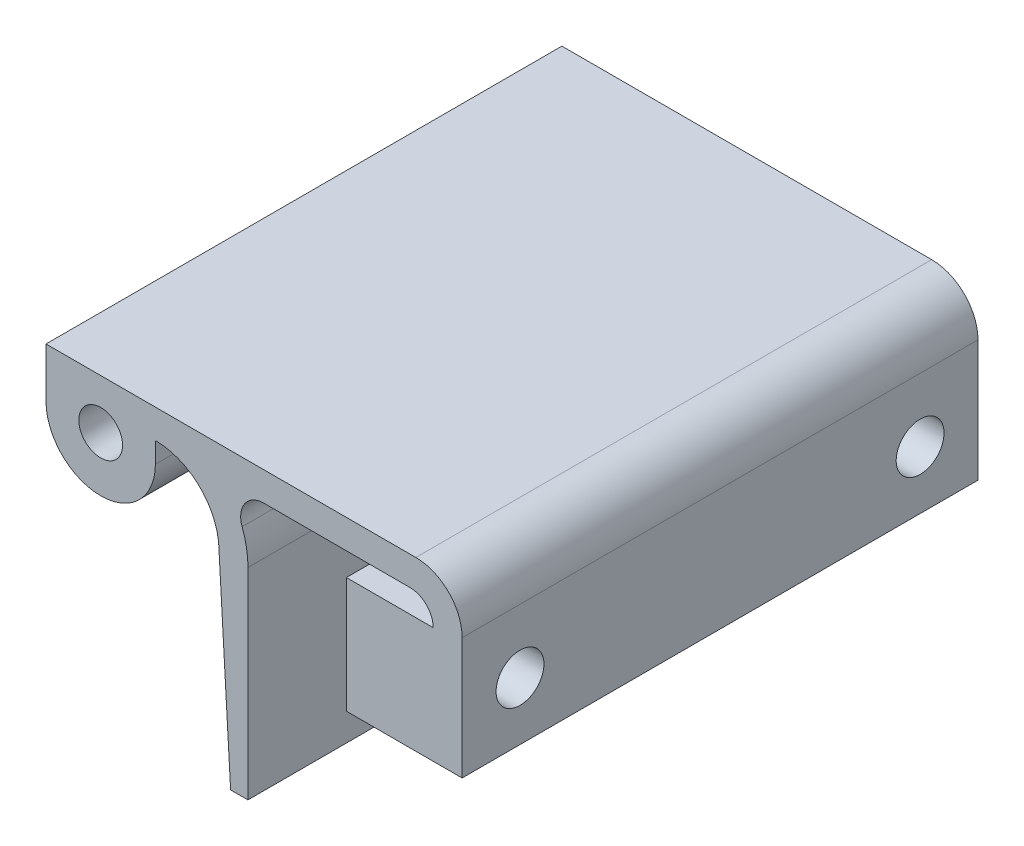
ISO-10303-21;
HEADER;
FILE_DESCRIPTION(('STEP AP214'),'2;1');
FILE_NAME('part.step','',(''),(''),'','','');
FILE_SCHEMA(('AUTOMOTIVE_DESIGN { 1 0 10303 214 1 1 1 1 }'));
ENDSEC;
DATA;
#1=APPLICATION_CONTEXT('core data for automotive mechanical design processes');
#2=APPLICATION_PROTOCOL_DEFINITION('international standard','automotive_design',2000,#1);
#3=PRODUCT_CONTEXT('',#1,'mechanical');
#4=PRODUCT('Part','Part','',(#3));
#5=PRODUCT_RELATED_PRODUCT_CATEGORY('part','',(#4));
#6=PRODUCT_DEFINITION_FORMATION('','',#4);
#7=PRODUCT_DEFINITION_CONTEXT('part definition',#1,'design');
#8=PRODUCT_DEFINITION('design','',#6,#7);
#9=PRODUCT_DEFINITION_SHAPE('','',#8);
#10=(LENGTH_UNIT() NAMED_UNIT(*) SI_UNIT(.MILLI.,.METRE.));
#11=(NAMED_UNIT(*) PLANE_ANGLE_UNIT() SI_UNIT($,.RADIAN.));
#12=(NAMED_UNIT(*) SI_UNIT($,.STERADIAN.) SOLID_ANGLE_UNIT());
#13=UNCERTAINTY_MEASURE_WITH_UNIT(LENGTH_MEASURE(1.E-05),#10,'distance_accuracy_value','');
#14=(GEOMETRIC_REPRESENTATION_CONTEXT(3) GLOBAL_UNCERTAINTY_ASSIGNED_CONTEXT((#13)) GLOBAL_UNIT_ASSIGNED_CONTEXT((#10,
#11,#12)) REPRESENTATION_CONTEXT('',''));
#15=CARTESIAN_POINT('',(0.,0.,0.));
#16=DIRECTION('',(0.,0.,1.));
#17=DIRECTION('',(1.,0.,0.));
#18=AXIS2_PLACEMENT_3D('',#15,#16,#17);
#19=CARTESIAN_POINT('',(-87.6031910632718,204.196458107681,56.59882));
#20=DIRECTION('',(0.,0.,1.));
#21=DIRECTION('',(1.,0.,0.));
#22=AXIS2_PLACEMENT_3D('',#19,#20,#21);
#23=PLANE('',#22);
#24=DIRECTION('',(0.,1.,0.));
#25=VECTOR('',#24,1.);
#26=CARTESIAN_POINT('',(-53.9481910632718,214.356458107681,56.59882));
#27=LINE('',#26,#25);
#28=CARTESIAN_POINT('',(-53.9481910632718,195.941458107681,56.59882));
#29=VERTEX_POINT('',#28);
#30=CARTESIAN_POINT('',(-53.9481910632718,209.276458107681,56.59882));
#31=VERTEX_POINT('',#30);
#32=EDGE_CURVE('E267',#29,#31,#27,.T.);
#33=ORIENTED_EDGE('',*,*,#32,.T.);
#34=CARTESIAN_POINT('',(-59.0281910632718,209.276458107681,56.59882));
#35=DIRECTION('',(0.,0.,1.));
#36=DIRECTION('',(1.,0.,0.));
#37=AXIS2_PLACEMENT_3D('',#34,#35,#36);
#38=CIRCLE('',#37,5.08);
#39=CARTESIAN_POINT('',(-59.0281910632718,214.356458107681,56.59882));
#40=VERTEX_POINT('',#39);
#41=EDGE_CURVE('E11',#31,#40,#38,.T.);
#42=ORIENTED_EDGE('',*,*,#41,.T.);
#43=DIRECTION('',(-1.,0.,0.));
#44=VECTOR('',#43,1.);
#45=CARTESIAN_POINT('',(-76.1731910632717,214.356458107681,56.59882));
#46=LINE('',#45,#44);
#47=CARTESIAN_POINT('',(-99.6031910632718,214.356458107681,56.59882));
#48=VERTEX_POINT('',#47);
#49=EDGE_CURVE('E269',#40,#48,#46,.T.);
#50=ORIENTED_EDGE('',*,*,#49,.T.);
#51=DIRECTION('',(0.,-1.,0.));
#52=VECTOR('',#51,1.);
#53=CARTESIAN_POINT('',(-99.6031910632718,214.356458107681,56.59882));
#54=LINE('',#53,#52);
#55=CARTESIAN_POINT('',(-99.6031910632718,208.926458107681,56.59882));
#56=VERTEX_POINT('',#55);
#57=EDGE_CURVE('E271',#48,#56,#54,.T.);
#58=ORIENTED_EDGE('',*,*,#57,.T.);
#59=CARTESIAN_POINT('',(-93.6031910632718,208.926458107681,56.59882));
#60=DIRECTION('',(0.,0.,1.));
#61=DIRECTION('',(-1.,0.,0.));
#62=AXIS2_PLACEMENT_3D('',#59,#60,#61);
#63=CIRCLE('',#62,6.);
#64=CARTESIAN_POINT('',(-87.6031910632718,208.926458107681,56.59882));
#65=VERTEX_POINT('',#64);
#66=EDGE_CURVE('E273',#56,#65,#63,.T.);
#67=ORIENTED_EDGE('',*,*,#66,.T.);
#68=DIRECTION('',(0.,1.,0.));
#69=VECTOR('',#68,1.);
#70=CARTESIAN_POINT('',(-87.6031910632718,211.181458107681,56.59882));
#71=LINE('',#70,#69);
#72=CARTESIAN_POINT('',(-87.6031910632718,211.181458107681,56.59882));
#73=VERTEX_POINT('',#72);
#74=EDGE_CURVE('E275',#65,#73,#71,.T.);
#75=ORIENTED_EDGE('',*,*,#74,.T.);
#76=CARTESIAN_POINT('',(-87.6031910632718,204.196458107681,56.59882));
#77=DIRECTION('',(0.,0.,-1.));
#78=DIRECTION('',(1.,0.,0.));
#79=AXIS2_PLACEMENT_3D('',#76,#77,#78);
#80=CIRCLE('',#79,6.98499999999999);
#81=CARTESIAN_POINT('',(-80.6181910632718,204.196458107681,56.59882));
#82=VERTEX_POINT('',#81);
#83=EDGE_CURVE('E277',#73,#82,#80,.T.);
#84=ORIENTED_EDGE('',*,*,#83,.T.);
#85=DIRECTION('',(0.0573854701794158,-0.998352096112533,0.));
#86=VECTOR('',#85,1.);
#87=CARTESIAN_POINT('',(-79.3482299485119,182.102566797948,56.59882));
#88=LINE('',#87,#86);
#89=CARTESIAN_POINT('',(-79.3482299485119,182.102566797948,56.59882));
#90=VERTEX_POINT('',#89);
#91=EDGE_CURVE('E279',#82,#90,#88,.T.);
#92=ORIENTED_EDGE('',*,*,#91,.T.);
#93=DIRECTION('',(0.999976021252525,0.00692509349893776,0.));
#94=VECTOR('',#93,1.);
#95=CARTESIAN_POINT('',(-77.4431910632718,182.115759686696,56.59882));
#96=LINE('',#95,#94);
#97=CARTESIAN_POINT('',(-77.4431910632718,182.115759686696,56.59882));
#98=VERTEX_POINT('',#97);
#99=EDGE_CURVE('E281',#90,#98,#96,.T.);
#100=ORIENTED_EDGE('',*,*,#99,.T.);
#101=DIRECTION('',(0.,1.,0.));
#102=VECTOR('',#101,1.);
#103=CARTESIAN_POINT('',(-77.4431910632718,182.115759686696,56.59882));
#104=LINE('',#103,#102);
#105=CARTESIAN_POINT('',(-77.4431910632718,204.196458107681,56.59882));
#106=VERTEX_POINT('',#105);
#107=EDGE_CURVE('E252',#98,#106,#104,.T.);
#108=ORIENTED_EDGE('',*,*,#107,.T.);
#109=CARTESIAN_POINT('',(-87.6031910632718,204.196458107681,56.59882));
#110=DIRECTION('',(0.,0.,1.));
#111=DIRECTION('',(1.,0.,0.));
#112=AXIS2_PLACEMENT_3D('',#109,#110,#111);
#113=CIRCLE('',#112,10.16);
#114=CARTESIAN_POINT('',(-78.0858141137126,207.752458107681,56.59882));
#115=VERTEX_POINT('',#114);
#116=EDGE_CURVE('E255',#106,#115,#113,.T.);
#117=ORIENTED_EDGE('',*,*,#116,.T.);
#118=CARTESIAN_POINT('',(-75.7064698763228,208.641458107681,56.59882));
#119=DIRECTION('',(0.,0.,-1.));
#120=DIRECTION('',(1.,0.,0.));
#121=AXIS2_PLACEMENT_3D('',#118,#119,#120);
#122=CIRCLE('',#121,2.53999999999999);
#123=CARTESIAN_POINT('',(-75.7064698763228,211.181458107681,56.59882));
#124=VERTEX_POINT('',#123);
#125=EDGE_CURVE('E258',#115,#124,#122,.T.);
#126=ORIENTED_EDGE('',*,*,#125,.T.);
#127=DIRECTION('',(1.,0.,0.));
#128=VECTOR('',#127,1.);
#129=CARTESIAN_POINT('',(-59.6631910632718,211.181458107681,56.59882));
#130=LINE('',#129,#128);
#131=CARTESIAN_POINT('',(-59.6631910632718,211.181458107681,56.59882));
#132=VERTEX_POINT('',#131);
#133=EDGE_CURVE('E260',#124,#132,#130,.T.);
#134=ORIENTED_EDGE('',*,*,#133,.T.);
#135=CARTESIAN_POINT('',(-59.6631910632717,208.641458107681,56.59882));
#136=DIRECTION('',(0.,0.,-1.));
#137=DIRECTION('',(1.,0.,0.));
#138=AXIS2_PLACEMENT_3D('',#135,#136,#137);
#139=CIRCLE('',#138,2.53999999999999);
#140=CARTESIAN_POINT('',(-57.1231910632717,208.641458107681,56.59882));
#141=VERTEX_POINT('',#140);
#142=EDGE_CURVE('E262',#132,#141,#139,.T.);
#143=ORIENTED_EDGE('',*,*,#142,.T.);
#144=DIRECTION('',(1.,0.,0.));
#145=VECTOR('',#144,1.);
#146=CARTESIAN_POINT('',(-66.6481910632718,208.641458107681,56.59882));
#147=LINE('',#146,#145);
#148=CARTESIAN_POINT('',(-66.6481910632718,208.641458107681,56.59882));
#149=VERTEX_POINT('',#148);
#150=EDGE_CURVE('E236',#149,#141,#147,.T.);
#151=ORIENTED_EDGE('',*,*,#150,.F.);
#152=DIRECTION('',(0.,-1.,0.));
#153=VECTOR('',#152,1.);
#154=CARTESIAN_POINT('',(-66.6481910632718,195.941458107681,56.59882));
#155=LINE('',#154,#153);
#156=CARTESIAN_POINT('',(-66.6481910632718,195.941458107681,56.59882));
#157=VERTEX_POINT('',#156);
#158=EDGE_CURVE('E223',#149,#157,#155,.T.);
#159=ORIENTED_EDGE('',*,*,#158,.T.);
#160=DIRECTION('',(1.,0.,0.));
#161=VECTOR('',#160,1.);
#162=CARTESIAN_POINT('',(-57.1231910632717,195.941458107681,56.59882));
#163=LINE('',#162,#161);
#164=EDGE_CURVE('E265',#157,#29,#163,.T.);
#165=ORIENTED_EDGE('',*,*,#164,.T.);
#166=EDGE_LOOP('',(#33,#42,#50,#58,#67,#75,#84,#92,#100,#108,#117,#126,#134,#143,#151,#159,#165));
#167=FACE_BOUND('',#166,.T.);
#168=CARTESIAN_POINT('',(-93.6031910632718,208.926458107681,56.59882));
#169=DIRECTION('',(0.,0.,1.));
#170=DIRECTION('',(1.,0.,0.));
#171=AXIS2_PLACEMENT_3D('',#168,#169,#170);
#172=CIRCLE('',#171,2.40000000000135);
#173=CARTESIAN_POINT('',(-91.2031910632704,208.926458107681,56.59882));
#174=VERTEX_POINT('',#173);
#175=EDGE_CURVE('E246',#174,#174,#172,.T.);
#176=ORIENTED_EDGE('',*,*,#175,.F.);
#177=EDGE_LOOP('',(#176));
#178=FACE_BOUND('',#177,.T.);
#179=ADVANCED_FACE('F36',(#167,#178),#23,.T.);
#180=CARTESIAN_POINT('',(-87.6031910632718,204.196458107681,0.));
#181=DIRECTION('',(0.,0.,1.));
#182=DIRECTION('',(1.,0.,0.));
#183=AXIS2_PLACEMENT_3D('',#180,#181,#182);
#184=PLANE('',#183);
#185=DIRECTION('',(-1.,0.,0.));
#186=VECTOR('',#185,1.);
#187=CARTESIAN_POINT('',(-99.6031910632718,214.356458107681,0.));
#188=LINE('',#187,#186);
#189=CARTESIAN_POINT('',(-59.0281910632718,214.356458107681,0.));
#190=VERTEX_POINT('',#189);
#191=CARTESIAN_POINT('',(-99.6031910632718,214.356458107681,0.));
#192=VERTEX_POINT('',#191);
#193=EDGE_CURVE('E297',#190,#192,#188,.T.);
#194=ORIENTED_EDGE('',*,*,#193,.F.);
#195=CARTESIAN_POINT('',(-59.0281910632718,209.276458107681,0.));
#196=DIRECTION('',(0.,0.,1.));
#197=DIRECTION('',(1.,0.,0.));
#198=AXIS2_PLACEMENT_3D('',#195,#196,#197);
#199=CIRCLE('',#198,5.08);
#200=CARTESIAN_POINT('',(-53.9481910632718,209.276458107681,0.));
#201=VERTEX_POINT('',#200);
#202=EDGE_CURVE('E58',#190,#201,#199,.F.);
#203=ORIENTED_EDGE('',*,*,#202,.T.);
#204=DIRECTION('',(0.,1.,0.));
#205=VECTOR('',#204,1.);
#206=CARTESIAN_POINT('',(-53.9481910632718,214.356458107681,0.));
#207=LINE('',#206,#205);
#208=CARTESIAN_POINT('',(-53.9481910632718,195.941458107681,0.));
#209=VERTEX_POINT('',#208);
#210=EDGE_CURVE('E295',#209,#201,#207,.T.);
#211=ORIENTED_EDGE('',*,*,#210,.F.);
#212=DIRECTION('',(1.,0.,0.));
#213=VECTOR('',#212,1.);
#214=CARTESIAN_POINT('',(-57.1231910632717,195.941458107681,0.));
#215=LINE('',#214,#213);
#216=CARTESIAN_POINT('',(-66.6481910632718,195.941458107681,0.));
#217=VERTEX_POINT('',#216);
#218=EDGE_CURVE('E204',#217,#209,#215,.T.);
#219=ORIENTED_EDGE('',*,*,#218,.F.);
#220=DIRECTION('',(0.,1.,0.));
#221=VECTOR('',#220,1.);
#222=CARTESIAN_POINT('',(-66.6481910632718,195.941458107681,0.));
#223=LINE('',#222,#221);
#224=CARTESIAN_POINT('',(-66.6481910632718,208.641458107681,0.));
#225=VERTEX_POINT('',#224);
#226=EDGE_CURVE('E196',#217,#225,#223,.T.);
#227=ORIENTED_EDGE('',*,*,#226,.T.);
#228=DIRECTION('',(1.,0.,0.));
#229=VECTOR('',#228,1.);
#230=CARTESIAN_POINT('',(-66.6481910632718,208.641458107681,0.));
#231=LINE('',#230,#229);
#232=CARTESIAN_POINT('',(-57.1231910632717,208.641458107681,0.));
#233=VERTEX_POINT('',#232);
#234=EDGE_CURVE('E180',#225,#233,#231,.T.);
#235=ORIENTED_EDGE('',*,*,#234,.T.);
#236=CARTESIAN_POINT('',(-59.6631910632717,208.641458107681,0.));
#237=DIRECTION('',(0.,0.,-1.));
#238=DIRECTION('',(1.,0.,0.));
#239=AXIS2_PLACEMENT_3D('',#236,#237,#238);
#240=CIRCLE('',#239,2.53999999999999);
#241=CARTESIAN_POINT('',(-59.6631910632718,211.181458107681,0.));
#242=VERTEX_POINT('',#241);
#243=EDGE_CURVE('E292',#242,#233,#240,.T.);
#244=ORIENTED_EDGE('',*,*,#243,.F.);
#245=DIRECTION('',(1.,0.,0.));
#246=VECTOR('',#245,1.);
#247=CARTESIAN_POINT('',(-59.6631910632718,211.181458107681,0.));
#248=LINE('',#247,#246);
#249=CARTESIAN_POINT('',(-75.7064698763228,211.181458107681,0.));
#250=VERTEX_POINT('',#249);
#251=EDGE_CURVE('E290',#250,#242,#248,.T.);
#252=ORIENTED_EDGE('',*,*,#251,.F.);
#253=CARTESIAN_POINT('',(-75.7064698763228,208.641458107681,0.));
#254=DIRECTION('',(0.,0.,-1.));
#255=DIRECTION('',(1.,0.,0.));
#256=AXIS2_PLACEMENT_3D('',#253,#254,#255);
#257=CIRCLE('',#256,2.53999999999999);
#258=CARTESIAN_POINT('',(-78.0858141137126,207.752458107681,0.));
#259=VERTEX_POINT('',#258);
#260=EDGE_CURVE('E288',#259,#250,#257,.T.);
#261=ORIENTED_EDGE('',*,*,#260,.F.);
#262=CARTESIAN_POINT('',(-87.6031910632718,204.196458107681,0.));
#263=DIRECTION('',(0.,0.,1.));
#264=DIRECTION('',(1.,0.,0.));
#265=AXIS2_PLACEMENT_3D('',#262,#263,#264);
#266=CIRCLE('',#265,10.16);
#267=CARTESIAN_POINT('',(-77.4431910632718,204.196458107681,0.));
#268=VERTEX_POINT('',#267);
#269=EDGE_CURVE('E286',#268,#259,#266,.T.);
#270=ORIENTED_EDGE('',*,*,#269,.F.);
#271=DIRECTION('',(0.,1.,0.));
#272=VECTOR('',#271,1.);
#273=CARTESIAN_POINT('',(-77.4431910632718,182.115759686696,0.));
#274=LINE('',#273,#272);
#275=CARTESIAN_POINT('',(-77.4431910632718,182.115759686696,0.));
#276=VERTEX_POINT('',#275);
#277=EDGE_CURVE('E249',#276,#268,#274,.T.);
#278=ORIENTED_EDGE('',*,*,#277,.F.);
#279=DIRECTION('',(0.999976021252525,0.00692509349893776,0.));
#280=VECTOR('',#279,1.);
#281=CARTESIAN_POINT('',(-77.4431910632718,182.115759686696,0.));
#282=LINE('',#281,#280);
#283=CARTESIAN_POINT('',(-79.3482299485119,182.102566797948,0.));
#284=VERTEX_POINT('',#283);
#285=EDGE_CURVE('E256',#284,#276,#282,.T.);
#286=ORIENTED_EDGE('',*,*,#285,.F.);
#287=DIRECTION('',(0.0573854701794158,-0.998352096112533,0.));
#288=VECTOR('',#287,1.);
#289=CARTESIAN_POINT('',(-79.3482299485119,182.102566797948,0.));
#290=LINE('',#289,#288);
#291=CARTESIAN_POINT('',(-80.6181910632718,204.196458107681,0.));
#292=VERTEX_POINT('',#291);
#293=EDGE_CURVE('E307',#292,#284,#290,.T.);
#294=ORIENTED_EDGE('',*,*,#293,.F.);
#295=CARTESIAN_POINT('',(-87.6031910632718,204.196458107681,0.));
#296=DIRECTION('',(0.,0.,-1.));
#297=DIRECTION('',(1.,0.,0.));
#298=AXIS2_PLACEMENT_3D('',#295,#296,#297);
#299=CIRCLE('',#298,6.98499999999999);
#300=CARTESIAN_POINT('',(-87.6031910632718,211.181458107681,0.));
#301=VERTEX_POINT('',#300);
#302=EDGE_CURVE('E305',#301,#292,#299,.T.);
#303=ORIENTED_EDGE('',*,*,#302,.F.);
#304=DIRECTION('',(0.,1.,0.));
#305=VECTOR('',#304,1.);
#306=CARTESIAN_POINT('',(-87.6031910632718,211.181458107681,0.));
#307=LINE('',#306,#305);
#308=CARTESIAN_POINT('',(-87.6031910632718,208.926458107681,0.));
#309=VERTEX_POINT('',#308);
#310=EDGE_CURVE('E303',#309,#301,#307,.T.);
#311=ORIENTED_EDGE('',*,*,#310,.F.);
#312=CARTESIAN_POINT('',(-93.6031910632718,208.926458107681,0.));
#313=DIRECTION('',(0.,0.,1.));
#314=DIRECTION('',(-1.,0.,0.));
#315=AXIS2_PLACEMENT_3D('',#312,#313,#314);
#316=CIRCLE('',#315,6.);
#317=CARTESIAN_POINT('',(-99.6031910632718,208.926458107681,0.));
#318=VERTEX_POINT('',#317);
#319=EDGE_CURVE('E301',#318,#309,#316,.T.);
#320=ORIENTED_EDGE('',*,*,#319,.F.);
#321=DIRECTION('',(0.,-1.,0.));
#322=VECTOR('',#321,1.);
#323=CARTESIAN_POINT('',(-99.6031910632718,214.356458107681,0.));
#324=LINE('',#323,#322);
#325=EDGE_CURVE('E299',#192,#318,#324,.T.);
#326=ORIENTED_EDGE('',*,*,#325,.F.);
#327=EDGE_LOOP('',(#194,#203,#211,#219,#227,#235,#244,#252,#261,#270,#278,#286,#294,#303,#311,
#320,#326));
#328=FACE_BOUND('',#327,.T.);
#329=CARTESIAN_POINT('',(-93.6031910632718,208.926458107681,0.));
#330=DIRECTION('',(0.,0.,1.));
#331=DIRECTION('',(1.,0.,0.));
#332=AXIS2_PLACEMENT_3D('',#329,#330,#331);
#333=CIRCLE('',#332,2.40000000000135);
#334=CARTESIAN_POINT('',(-91.2031910632704,208.926458107681,0.));
#335=VERTEX_POINT('',#334);
#336=EDGE_CURVE('E245',#335,#335,#333,.T.);
#337=ORIENTED_EDGE('',*,*,#336,.T.);
#338=EDGE_LOOP('',(#337));
#339=FACE_BOUND('',#338,.T.);
#340=ADVANCED_FACE('F201',(#328,#339),#184,.F.);
#341=CARTESIAN_POINT('',(-77.4431910632718,182.115759686696,56.59882));
#342=DIRECTION('',(-1.,0.,0.));
#343=DIRECTION('',(0.,0.,1.));
#344=AXIS2_PLACEMENT_3D('',#341,#342,#343);
#345=PLANE('',#344);
#346=ORIENTED_EDGE('',*,*,#277,.T.);
#347=DIRECTION('',(0.,0.,-1.));
#348=VECTOR('',#347,1.);
#349=CARTESIAN_POINT('',(-77.4431910632718,204.196458107681,56.59882));
#350=LINE('',#349,#348);
#351=EDGE_CURVE('E347',#106,#268,#350,.T.);
#352=ORIENTED_EDGE('',*,*,#351,.F.);
#353=ORIENTED_EDGE('',*,*,#107,.F.);
#354=DIRECTION('',(0.,0.,-1.));
#355=VECTOR('',#354,1.);
#356=CARTESIAN_POINT('',(-77.4431910632718,182.115759686696,56.59882));
#357=LINE('',#356,#355);
#358=EDGE_CURVE('E283',#98,#276,#357,.T.);
#359=ORIENTED_EDGE('',*,*,#358,.T.);
#360=EDGE_LOOP('',(#346,#352,#353,#359));
#361=FACE_BOUND('',#360,.T.);
#362=ADVANCED_FACE('F388',(#361),#345,.F.);
#363=CARTESIAN_POINT('',(-87.6031910632718,204.196458107681,56.59882));
#364=DIRECTION('',(0.,0.,-1.));
#365=DIRECTION('',(-1.,0.,0.));
#366=AXIS2_PLACEMENT_3D('',#363,#364,#365);
#367=CYLINDRICAL_SURFACE('',#366,10.16);
#368=ORIENTED_EDGE('',*,*,#269,.T.);
#369=DIRECTION('',(0.,0.,-1.));
#370=VECTOR('',#369,1.);
#371=CARTESIAN_POINT('',(-78.0858141137126,207.752458107681,56.59882));
#372=LINE('',#371,#370);
#373=EDGE_CURVE('E344',#115,#259,#372,.T.);
#374=ORIENTED_EDGE('',*,*,#373,.F.);
#375=ORIENTED_EDGE('',*,*,#116,.F.);
#376=ORIENTED_EDGE('',*,*,#351,.T.);
#377=EDGE_LOOP('',(#368,#374,#375,#376));
#378=FACE_BOUND('',#377,.T.);
#379=ADVANCED_FACE('F439',(#378),#367,.T.);
#380=CARTESIAN_POINT('',(-75.7064698763228,208.641458107681,56.59882));
#381=DIRECTION('',(0.,0.,-1.));
#382=DIRECTION('',(-1.,0.,0.));
#383=AXIS2_PLACEMENT_3D('',#380,#381,#382);
#384=CYLINDRICAL_SURFACE('',#383,2.53999999999999);
#385=ORIENTED_EDGE('',*,*,#260,.T.);
#386=DIRECTION('',(0.,0.,-1.));
#387=VECTOR('',#386,1.);
#388=CARTESIAN_POINT('',(-75.7064698763228,211.181458107681,56.59882));
#389=LINE('',#388,#387);
#390=EDGE_CURVE('E341',#124,#250,#389,.T.);
#391=ORIENTED_EDGE('',*,*,#390,.F.);
#392=ORIENTED_EDGE('',*,*,#125,.F.);
#393=ORIENTED_EDGE('',*,*,#373,.T.);
#394=EDGE_LOOP('',(#385,#391,#392,#393));
#395=FACE_BOUND('',#394,.T.);
#396=ADVANCED_FACE('F435',(#395),#384,.F.);
#397=CARTESIAN_POINT('',(-59.6631910632718,211.181458107681,56.59882));
#398=DIRECTION('',(0.,1.,0.));
#399=DIRECTION('',(0.,0.,1.));
#400=AXIS2_PLACEMENT_3D('',#397,#398,#399);
#401=PLANE('',#400);
#402=ORIENTED_EDGE('',*,*,#251,.T.);
#403=DIRECTION('',(0.,0.,-1.));
#404=VECTOR('',#403,1.);
#405=CARTESIAN_POINT('',(-59.6631910632718,211.181458107681,56.59882));
#406=LINE('',#405,#404);
#407=EDGE_CURVE('E338',#132,#242,#406,.T.);
#408=ORIENTED_EDGE('',*,*,#407,.F.);
#409=ORIENTED_EDGE('',*,*,#133,.F.);
#410=ORIENTED_EDGE('',*,*,#390,.T.);
#411=EDGE_LOOP('',(#402,#408,#409,#410));
#412=FACE_BOUND('',#411,.T.);
#413=ADVANCED_FACE('F431',(#412),#401,.F.);
#414=CARTESIAN_POINT('',(-59.6631910632717,208.641458107681,56.59882));
#415=DIRECTION('',(0.,0.,-1.));
#416=DIRECTION('',(-1.,0.,0.));
#417=AXIS2_PLACEMENT_3D('',#414,#415,#416);
#418=CYLINDRICAL_SURFACE('',#417,2.53999999999999);
#419=ORIENTED_EDGE('',*,*,#243,.T.);
#420=DIRECTION('',(0.,0.,1.));
#421=VECTOR('',#420,1.);
#422=CARTESIAN_POINT('',(-57.1231910632717,208.641458107681,56.59882));
#423=LINE('',#422,#421);
#424=CARTESIAN_POINT('',(-57.1231910632717,208.641458107681,12.7));
#425=VERTEX_POINT('',#424);
#426=EDGE_CURVE('E185',#233,#425,#423,.T.);
#427=ORIENTED_EDGE('',*,*,#426,.T.);
#428=DIRECTION('',(0.,0.,-1.));
#429=VECTOR('',#428,1.);
#430=CARTESIAN_POINT('',(-57.1231910632717,208.641458107681,56.59882));
#431=LINE('',#430,#429);
#432=CARTESIAN_POINT('',(-57.1231910632717,208.641458107681,43.89882));
#433=VERTEX_POINT('',#432);
#434=EDGE_CURVE('E335',#433,#425,#431,.T.);
#435=ORIENTED_EDGE('',*,*,#434,.F.);
#436=EDGE_CURVE('E336',#141,#433,#431,.T.);
#437=ORIENTED_EDGE('',*,*,#436,.F.);
#438=ORIENTED_EDGE('',*,*,#142,.F.);
#439=ORIENTED_EDGE('',*,*,#407,.T.);
#440=EDGE_LOOP('',(#419,#427,#435,#437,#438,#439));
#441=FACE_BOUND('',#440,.T.);
#442=ADVANCED_FACE('F427',(#441),#418,.F.);
#443=CARTESIAN_POINT('',(-57.1231910632717,208.641458107681,56.59882));
#444=DIRECTION('',(1.,0.,0.));
#445=DIRECTION('',(0.,0.,-1.));
#446=AXIS2_PLACEMENT_3D('',#443,#444,#445);
#447=PLANE('',#446);
#448=ORIENTED_EDGE('',*,*,#434,.T.);
#449=DIRECTION('',(0.,-1.,0.));
#450=VECTOR('',#449,1.);
#451=CARTESIAN_POINT('',(-57.1231910632717,208.641458107681,12.7));
#452=LINE('',#451,#450);
#453=CARTESIAN_POINT('',(-57.1231910632717,195.941458107681,12.7));
#454=VERTEX_POINT('',#453);
#455=EDGE_CURVE('E221',#425,#454,#452,.T.);
#456=ORIENTED_EDGE('',*,*,#455,.T.);
#457=DIRECTION('',(0.,0.,-1.));
#458=VECTOR('',#457,1.);
#459=CARTESIAN_POINT('',(-57.1231910632717,195.941458107681,56.59882));
#460=LINE('',#459,#458);
#461=CARTESIAN_POINT('',(-57.1231910632717,195.941458107681,43.89882));
#462=VERTEX_POINT('',#461);
#463=EDGE_CURVE('E332',#462,#454,#460,.T.);
#464=ORIENTED_EDGE('',*,*,#463,.F.);
#465=DIRECTION('',(0.,1.,0.));
#466=VECTOR('',#465,1.);
#467=CARTESIAN_POINT('',(-57.1231910632717,208.641458107681,43.89882));
#468=LINE('',#467,#466);
#469=EDGE_CURVE('E238',#462,#433,#468,.T.);
#470=ORIENTED_EDGE('',*,*,#469,.T.);
#471=EDGE_LOOP('',(#448,#456,#464,#470));
#472=FACE_BOUND('',#471,.T.);
#473=ADVANCED_FACE('F423',(#472),#447,.F.);
#474=CARTESIAN_POINT('',(-57.1231910632717,195.941458107681,56.59882));
#475=DIRECTION('',(0.,1.,0.));
#476=DIRECTION('',(0.,0.,1.));
#477=AXIS2_PLACEMENT_3D('',#474,#475,#476);
#478=PLANE('',#477);
#479=ORIENTED_EDGE('',*,*,#463,.T.);
#480=DIRECTION('',(1.,0.,0.));
#481=VECTOR('',#480,1.);
#482=CARTESIAN_POINT('',(-66.6481910632718,195.941458107681,12.7));
#483=LINE('',#482,#481);
#484=CARTESIAN_POINT('',(-66.6481910632718,195.941458107681,12.7));
#485=VERTEX_POINT('',#484);
#486=EDGE_CURVE('E216',#485,#454,#483,.T.);
#487=ORIENTED_EDGE('',*,*,#486,.F.);
#488=DIRECTION('',(0.,0.,-1.));
#489=VECTOR('',#488,1.);
#490=CARTESIAN_POINT('',(-66.6481910632718,195.941458107681,0.));
#491=LINE('',#490,#489);
#492=EDGE_CURVE('E189',#485,#217,#491,.T.);
#493=ORIENTED_EDGE('',*,*,#492,.T.);
#494=ORIENTED_EDGE('',*,*,#218,.T.);
#495=DIRECTION('',(0.,0.,-1.));
#496=VECTOR('',#495,1.);
#497=CARTESIAN_POINT('',(-53.9481910632718,195.941458107681,56.59882));
#498=LINE('',#497,#496);
#499=EDGE_CURVE('E330',#29,#209,#498,.T.);
#500=ORIENTED_EDGE('',*,*,#499,.F.);
#501=ORIENTED_EDGE('',*,*,#164,.F.);
#502=DIRECTION('',(0.,0.,-1.));
#503=VECTOR('',#502,1.);
#504=CARTESIAN_POINT('',(-66.6481910632718,195.941458107681,56.59882));
#505=LINE('',#504,#503);
#506=CARTESIAN_POINT('',(-66.6481910632718,195.941458107681,43.89882));
#507=VERTEX_POINT('',#506);
#508=EDGE_CURVE('E226',#157,#507,#505,.T.);
#509=ORIENTED_EDGE('',*,*,#508,.T.);
#510=DIRECTION('',(1.,0.,0.));
#511=VECTOR('',#510,1.);
#512=CARTESIAN_POINT('',(-66.6481910632718,195.941458107681,43.89882));
#513=LINE('',#512,#511);
#514=EDGE_CURVE('E235',#507,#462,#513,.T.);
#515=ORIENTED_EDGE('',*,*,#514,.T.);
#516=EDGE_LOOP('',(#479,#487,#493,#494,#500,#501,#509,#515));
#517=FACE_BOUND('',#516,.T.);
#518=ADVANCED_FACE('F419',(#517),#478,.F.);
#519=CARTESIAN_POINT('',(-53.9481910632718,214.356458107681,56.59882));
#520=DIRECTION('',(-1.,0.,0.));
#521=DIRECTION('',(0.,0.,1.));
#522=AXIS2_PLACEMENT_3D('',#519,#520,#521);
#523=PLANE('',#522);
#524=CARTESIAN_POINT('',(-53.9481910632718,202.291458107681,50.24882));
#525=DIRECTION('',(1.,0.,0.));
#526=DIRECTION('',(0.,0.,-1.));
#527=AXIS2_PLACEMENT_3D('',#524,#525,#526);
#528=CIRCLE('',#527,2.625);
#529=CARTESIAN_POINT('',(-53.9481910632718,202.291458107681,47.62382));
#530=VERTEX_POINT('',#529);
#531=EDGE_CURVE('E208',#530,#530,#528,.T.);
#532=ORIENTED_EDGE('',*,*,#531,.F.);
#533=EDGE_LOOP('',(#532));
#534=FACE_BOUND('',#533,.T.);
#535=CARTESIAN_POINT('',(-53.9481910632718,202.291458107681,6.35));
#536=DIRECTION('',(1.,0.,0.));
#537=DIRECTION('',(0.,0.,-1.));
#538=AXIS2_PLACEMENT_3D('',#535,#536,#537);
#539=CIRCLE('',#538,2.625);
#540=CARTESIAN_POINT('',(-53.9481910632718,202.291458107681,3.725));
#541=VERTEX_POINT('',#540);
#542=EDGE_CURVE('E211',#541,#541,#539,.T.);
#543=ORIENTED_EDGE('',*,*,#542,.F.);
#544=EDGE_LOOP('',(#543));
#545=FACE_BOUND('',#544,.T.);
#546=ORIENTED_EDGE('',*,*,#210,.T.);
#547=DIRECTION('',(0.,0.,-1.));
#548=VECTOR('',#547,1.);
#549=CARTESIAN_POINT('',(-53.9481910632718,209.276458107681,56.59882));
#550=LINE('',#549,#548);
#551=EDGE_CURVE('E44',#201,#31,#550,.F.);
#552=ORIENTED_EDGE('',*,*,#551,.T.);
#553=ORIENTED_EDGE('',*,*,#32,.F.);
#554=ORIENTED_EDGE('',*,*,#499,.T.);
#555=EDGE_LOOP('',(#546,#552,#553,#554));
#556=FACE_BOUND('',#555,.T.);
#557=ADVANCED_FACE('F416',(#534,#545,#556),#523,.F.);
#558=CARTESIAN_POINT('',(-99.6031910632718,214.356458107681,56.59882));
#559=DIRECTION('',(0.,-1.,0.));
#560=DIRECTION('',(0.,0.,-1.));
#561=AXIS2_PLACEMENT_3D('',#558,#559,#560);
#562=PLANE('',#561);
#563=ORIENTED_EDGE('',*,*,#49,.F.);
#564=DIRECTION('',(0.,0.,-1.));
#565=VECTOR('',#564,1.);
#566=CARTESIAN_POINT('',(-59.0281910632718,214.356458107681,56.59882));
#567=LINE('',#566,#565);
#568=EDGE_CURVE('E350',#40,#190,#567,.T.);
#569=ORIENTED_EDGE('',*,*,#568,.T.);
#570=ORIENTED_EDGE('',*,*,#193,.T.);
#571=DIRECTION('',(0.,0.,-1.));
#572=VECTOR('',#571,1.);
#573=CARTESIAN_POINT('',(-99.6031910632718,214.356458107681,56.59882));
#574=LINE('',#573,#572);
#575=EDGE_CURVE('E327',#48,#192,#574,.T.);
#576=ORIENTED_EDGE('',*,*,#575,.F.);
#577=EDGE_LOOP('',(#563,#569,#570,#576));
#578=FACE_BOUND('',#577,.T.);
#579=ADVANCED_FACE('F356',(#578),#562,.F.);
#580=CARTESIAN_POINT('',(-99.6031910632718,214.356458107681,56.59882));
#581=DIRECTION('',(1.,0.,0.));
#582=DIRECTION('',(0.,0.,-1.));
#583=AXIS2_PLACEMENT_3D('',#580,#581,#582);
#584=PLANE('',#583);
#585=ORIENTED_EDGE('',*,*,#325,.T.);
#586=DIRECTION('',(0.,0.,-1.));
#587=VECTOR('',#586,1.);
#588=CARTESIAN_POINT('',(-99.6031910632718,208.926458107681,56.59882));
#589=LINE('',#588,#587);
#590=EDGE_CURVE('E324',#56,#318,#589,.T.);
#591=ORIENTED_EDGE('',*,*,#590,.F.);
#592=ORIENTED_EDGE('',*,*,#57,.F.);
#593=ORIENTED_EDGE('',*,*,#575,.T.);
#594=EDGE_LOOP('',(#585,#591,#592,#593));
#595=FACE_BOUND('',#594,.T.);
#596=ADVANCED_FACE('F365',(#595),#584,.F.);
#597=CARTESIAN_POINT('',(-93.6031910632718,208.926458107681,56.59882));
#598=DIRECTION('',(0.,0.,-1.));
#599=DIRECTION('',(-1.,0.,0.));
#600=AXIS2_PLACEMENT_3D('',#597,#598,#599);
#601=CYLINDRICAL_SURFACE('',#600,6.);
#602=ORIENTED_EDGE('',*,*,#319,.T.);
#603=DIRECTION('',(0.,0.,-1.));
#604=VECTOR('',#603,1.);
#605=CARTESIAN_POINT('',(-87.6031910632718,208.926458107681,56.59882));
#606=LINE('',#605,#604);
#607=EDGE_CURVE('E321',#65,#309,#606,.T.);
#608=ORIENTED_EDGE('',*,*,#607,.F.);
#609=ORIENTED_EDGE('',*,*,#66,.F.);
#610=ORIENTED_EDGE('',*,*,#590,.T.);
#611=EDGE_LOOP('',(#602,#608,#609,#610));
#612=FACE_BOUND('',#611,.T.);
#613=ADVANCED_FACE('F369',(#612),#601,.T.);
#614=CARTESIAN_POINT('',(-87.6031910632718,211.181458107681,56.59882));
#615=DIRECTION('',(-1.,0.,0.));
#616=DIRECTION('',(0.,0.,1.));
#617=AXIS2_PLACEMENT_3D('',#614,#615,#616);
#618=PLANE('',#617);
#619=ORIENTED_EDGE('',*,*,#310,.T.);
#620=DIRECTION('',(0.,0.,-1.));
#621=VECTOR('',#620,1.);
#622=CARTESIAN_POINT('',(-87.6031910632718,211.181458107681,56.59882));
#623=LINE('',#622,#621);
#624=EDGE_CURVE('E318',#73,#301,#623,.T.);
#625=ORIENTED_EDGE('',*,*,#624,.F.);
#626=ORIENTED_EDGE('',*,*,#74,.F.);
#627=ORIENTED_EDGE('',*,*,#607,.T.);
#628=EDGE_LOOP('',(#619,#625,#626,#627));
#629=FACE_BOUND('',#628,.T.);
#630=ADVANCED_FACE('F405',(#629),#618,.F.);
#631=CARTESIAN_POINT('',(-87.6031910632718,204.196458107681,56.59882));
#632=DIRECTION('',(0.,0.,-1.));
#633=DIRECTION('',(-1.,0.,0.));
#634=AXIS2_PLACEMENT_3D('',#631,#632,#633);
#635=CYLINDRICAL_SURFACE('',#634,6.98499999999999);
#636=ORIENTED_EDGE('',*,*,#302,.T.);
#637=DIRECTION('',(0.,0.,-1.));
#638=VECTOR('',#637,1.);
#639=CARTESIAN_POINT('',(-80.6181910632718,204.196458107681,56.59882));
#640=LINE('',#639,#638);
#641=EDGE_CURVE('E315',#82,#292,#640,.T.);
#642=ORIENTED_EDGE('',*,*,#641,.F.);
#643=ORIENTED_EDGE('',*,*,#83,.F.);
#644=ORIENTED_EDGE('',*,*,#624,.T.);
#645=EDGE_LOOP('',(#636,#642,#643,#644));
#646=FACE_BOUND('',#645,.T.);
#647=ADVANCED_FACE('F401',(#646),#635,.F.);
#648=CARTESIAN_POINT('',(-79.3482299485119,182.102566797948,56.59882));
#649=DIRECTION('',(0.998352096112533,0.0573854701794158,0.));
#650=DIRECTION('',(-0.0573854701794158,0.998352096112533,0.));
#651=AXIS2_PLACEMENT_3D('',#648,#649,#650);
#652=PLANE('',#651);
#653=ORIENTED_EDGE('',*,*,#293,.T.);
#654=DIRECTION('',(0.,0.,-1.));
#655=VECTOR('',#654,1.);
#656=CARTESIAN_POINT('',(-79.3482299485119,182.102566797948,56.59882));
#657=LINE('',#656,#655);
#658=EDGE_CURVE('E312',#90,#284,#657,.T.);
#659=ORIENTED_EDGE('',*,*,#658,.F.);
#660=ORIENTED_EDGE('',*,*,#91,.F.);
#661=ORIENTED_EDGE('',*,*,#641,.T.);
#662=EDGE_LOOP('',(#653,#659,#660,#661));
#663=FACE_BOUND('',#662,.T.);
#664=ADVANCED_FACE('F397',(#663),#652,.F.);
#665=CARTESIAN_POINT('',(-77.4431910632718,182.115759686696,56.59882));
#666=DIRECTION('',(-0.00692509349893775,0.999976021252525,0.));
#667=DIRECTION('',(-0.999976021252525,-0.00692509349893776,0.));
#668=AXIS2_PLACEMENT_3D('',#665,#666,#667);
#669=PLANE('',#668);
#670=ORIENTED_EDGE('',*,*,#285,.T.);
#671=ORIENTED_EDGE('',*,*,#358,.F.);
#672=ORIENTED_EDGE('',*,*,#99,.F.);
#673=ORIENTED_EDGE('',*,*,#658,.T.);
#674=EDGE_LOOP('',(#670,#671,#672,#673));
#675=FACE_BOUND('',#674,.T.);
#676=ADVANCED_FACE('F394',(#675),#669,.F.);
#677=CARTESIAN_POINT('',(-93.6031910632718,208.926458107681,56.59882));
#678=DIRECTION('',(0.,0.,-1.));
#679=DIRECTION('',(-1.,0.,0.));
#680=AXIS2_PLACEMENT_3D('',#677,#678,#679);
#681=CYLINDRICAL_SURFACE('',#680,2.40000000000135);
#682=ORIENTED_EDGE('',*,*,#175,.T.);
#683=EDGE_LOOP('',(#682));
#684=FACE_BOUND('',#683,.T.);
#685=ORIENTED_EDGE('',*,*,#336,.F.);
#686=EDGE_LOOP('',(#685));
#687=FACE_BOUND('',#686,.T.);
#688=ADVANCED_FACE('F391',(#684,#687),#681,.F.);
#689=CARTESIAN_POINT('',(-66.6481910632718,208.641458107681,56.59882));
#690=DIRECTION('',(0.,1.,0.));
#691=DIRECTION('',(0.,0.,1.));
#692=AXIS2_PLACEMENT_3D('',#689,#690,#691);
#693=PLANE('',#692);
#694=ORIENTED_EDGE('',*,*,#436,.T.);
#695=DIRECTION('',(1.,0.,0.));
#696=VECTOR('',#695,1.);
#697=CARTESIAN_POINT('',(-66.6481910632718,208.641458107681,43.89882));
#698=LINE('',#697,#696);
#699=CARTESIAN_POINT('',(-66.6481910632718,208.641458107681,43.89882));
#700=VERTEX_POINT('',#699);
#701=EDGE_CURVE('E239',#700,#433,#698,.T.);
#702=ORIENTED_EDGE('',*,*,#701,.F.);
#703=DIRECTION('',(0.,0.,1.));
#704=VECTOR('',#703,1.);
#705=CARTESIAN_POINT('',(-66.6481910632718,208.641458107681,56.59882));
#706=LINE('',#705,#704);
#707=EDGE_CURVE('E232',#700,#149,#706,.T.);
#708=ORIENTED_EDGE('',*,*,#707,.T.);
#709=ORIENTED_EDGE('',*,*,#150,.T.);
#710=EDGE_LOOP('',(#694,#702,#708,#709));
#711=FACE_BOUND('',#710,.T.);
#712=ADVANCED_FACE('F476',(#711),#693,.T.);
#713=CARTESIAN_POINT('',(-66.6481910632718,195.941458107681,43.89882));
#714=DIRECTION('',(0.,0.,-1.));
#715=DIRECTION('',(-1.,0.,0.));
#716=AXIS2_PLACEMENT_3D('',#713,#714,#715);
#717=PLANE('',#716);
#718=ORIENTED_EDGE('',*,*,#469,.F.);
#719=ORIENTED_EDGE('',*,*,#514,.F.);
#720=DIRECTION('',(0.,1.,0.));
#721=VECTOR('',#720,1.);
#722=CARTESIAN_POINT('',(-66.6481910632718,195.941458107681,43.89882));
#723=LINE('',#722,#721);
#724=EDGE_CURVE('E229',#507,#700,#723,.T.);
#725=ORIENTED_EDGE('',*,*,#724,.T.);
#726=ORIENTED_EDGE('',*,*,#701,.T.);
#727=EDGE_LOOP('',(#718,#719,#725,#726));
#728=FACE_BOUND('',#727,.T.);
#729=ADVANCED_FACE('F479',(#728),#717,.T.);
#730=CARTESIAN_POINT('',(-66.6481910632718,0.,0.));
#731=DIRECTION('',(-1.,0.,0.));
#732=DIRECTION('',(0.,0.,1.));
#733=AXIS2_PLACEMENT_3D('',#730,#731,#732);
#734=PLANE('',#733);
#735=CARTESIAN_POINT('',(-66.6481910632718,202.291458107681,50.24882));
#736=DIRECTION('',(-1.,0.,0.));
#737=DIRECTION('',(0.,0.,1.));
#738=AXIS2_PLACEMENT_3D('',#735,#736,#737);
#739=CIRCLE('',#738,2.625);
#740=CARTESIAN_POINT('',(-66.6481910632718,202.291458107681,52.87382));
#741=VERTEX_POINT('',#740);
#742=EDGE_CURVE('E205',#741,#741,#739,.F.);
#743=ORIENTED_EDGE('',*,*,#742,.T.);
#744=EDGE_LOOP('',(#743));
#745=FACE_BOUND('',#744,.T.);
#746=ORIENTED_EDGE('',*,*,#158,.F.);
#747=ORIENTED_EDGE('',*,*,#707,.F.);
#748=ORIENTED_EDGE('',*,*,#724,.F.);
#749=ORIENTED_EDGE('',*,*,#508,.F.);
#750=EDGE_LOOP('',(#746,#747,#748,#749));
#751=FACE_BOUND('',#750,.T.);
#752=ADVANCED_FACE('F474',(#745,#751),#734,.T.);
#753=CARTESIAN_POINT('',(-66.6481910632718,195.941458107681,12.7));
#754=DIRECTION('',(0.,0.,1.));
#755=DIRECTION('',(1.,0.,0.));
#756=AXIS2_PLACEMENT_3D('',#753,#754,#755);
#757=PLANE('',#756);
#758=ORIENTED_EDGE('',*,*,#455,.F.);
#759=DIRECTION('',(1.,0.,0.));
#760=VECTOR('',#759,1.);
#761=CARTESIAN_POINT('',(-66.6481910632718,208.641458107681,12.7));
#762=LINE('',#761,#760);
#763=CARTESIAN_POINT('',(-66.6481910632718,208.641458107681,12.7));
#764=VERTEX_POINT('',#763);
#765=EDGE_CURVE('E188',#764,#425,#762,.T.);
#766=ORIENTED_EDGE('',*,*,#765,.F.);
#767=DIRECTION('',(0.,-1.,0.));
#768=VECTOR('',#767,1.);
#769=CARTESIAN_POINT('',(-66.6481910632718,195.941458107681,12.7));
#770=LINE('',#769,#768);
#771=EDGE_CURVE('E199',#764,#485,#770,.T.);
#772=ORIENTED_EDGE('',*,*,#771,.T.);
#773=ORIENTED_EDGE('',*,*,#486,.T.);
#774=EDGE_LOOP('',(#758,#766,#772,#773));
#775=FACE_BOUND('',#774,.T.);
#776=ADVANCED_FACE('F484',(#775),#757,.T.);
#777=CARTESIAN_POINT('',(-66.6481910632718,208.641458107681,0.));
#778=DIRECTION('',(0.,1.,0.));
#779=DIRECTION('',(0.,0.,1.));
#780=AXIS2_PLACEMENT_3D('',#777,#778,#779);
#781=PLANE('',#780);
#782=ORIENTED_EDGE('',*,*,#426,.F.);
#783=ORIENTED_EDGE('',*,*,#234,.F.);
#784=DIRECTION('',(0.,0.,1.));
#785=VECTOR('',#784,1.);
#786=CARTESIAN_POINT('',(-66.6481910632718,208.641458107681,0.));
#787=LINE('',#786,#785);
#788=EDGE_CURVE('E184',#225,#764,#787,.T.);
#789=ORIENTED_EDGE('',*,*,#788,.T.);
#790=ORIENTED_EDGE('',*,*,#765,.T.);
#791=EDGE_LOOP('',(#782,#783,#789,#790));
#792=FACE_BOUND('',#791,.T.);
#793=ADVANCED_FACE('F182',(#792),#781,.T.);
#794=CARTESIAN_POINT('',(-66.6481910632718,0.,0.));
#795=DIRECTION('',(1.,0.,0.));
#796=DIRECTION('',(0.,0.,-1.));
#797=AXIS2_PLACEMENT_3D('',#794,#795,#796);
#798=PLANE('',#797);
#799=CARTESIAN_POINT('',(-66.6481910632718,202.291458107681,6.35));
#800=DIRECTION('',(1.,0.,0.));
#801=DIRECTION('',(0.,0.,-1.));
#802=AXIS2_PLACEMENT_3D('',#799,#800,#801);
#803=CIRCLE('',#802,2.625);
#804=CARTESIAN_POINT('',(-66.6481910632718,202.291458107681,3.725));
#805=VERTEX_POINT('',#804);
#806=EDGE_CURVE('E683',#805,#805,#803,.F.);
#807=ORIENTED_EDGE('',*,*,#806,.F.);
#808=EDGE_LOOP('',(#807));
#809=FACE_BOUND('',#808,.T.);
#810=ORIENTED_EDGE('',*,*,#226,.F.);
#811=ORIENTED_EDGE('',*,*,#492,.F.);
#812=ORIENTED_EDGE('',*,*,#771,.F.);
#813=ORIENTED_EDGE('',*,*,#788,.F.);
#814=EDGE_LOOP('',(#810,#811,#812,#813));
#815=FACE_BOUND('',#814,.T.);
#816=ADVANCED_FACE('F194',(#809,#815),#798,.F.);
#817=CARTESIAN_POINT('',(-99.6041910632718,202.291458107681,6.35));
#818=DIRECTION('',(1.,0.,0.));
#819=DIRECTION('',(0.,0.,-1.));
#820=AXIS2_PLACEMENT_3D('',#817,#818,#819);
#821=CYLINDRICAL_SURFACE('',#820,2.625);
#822=ORIENTED_EDGE('',*,*,#542,.T.);
#823=EDGE_LOOP('',(#822));
#824=FACE_BOUND('',#823,.T.);
#825=ORIENTED_EDGE('',*,*,#806,.T.);
#826=EDGE_LOOP('',(#825));
#827=FACE_BOUND('',#826,.T.);
#828=ADVANCED_FACE('F380',(#824,#827),#821,.F.);
#829=CARTESIAN_POINT('',(-99.6041910632718,202.291458107681,50.24882));
#830=DIRECTION('',(1.,0.,0.));
#831=DIRECTION('',(0.,0.,-1.));
#832=AXIS2_PLACEMENT_3D('',#829,#830,#831);
#833=CYLINDRICAL_SURFACE('',#832,2.625);
#834=ORIENTED_EDGE('',*,*,#742,.F.);
#835=EDGE_LOOP('',(#834));
#836=FACE_BOUND('',#835,.T.);
#837=ORIENTED_EDGE('',*,*,#531,.T.);
#838=EDGE_LOOP('',(#837));
#839=FACE_BOUND('',#838,.T.);
#840=ADVANCED_FACE('F376',(#836,#839),#833,.F.);
#841=CARTESIAN_POINT('',(-59.0281910632718,209.276458107681,56.59882));
#842=DIRECTION('',(0.,0.,-1.));
#843=DIRECTION('',(-1.,0.,0.));
#844=AXIS2_PLACEMENT_3D('',#841,#842,#843);
#845=CYLINDRICAL_SURFACE('',#844,5.08);
#846=ORIENTED_EDGE('',*,*,#41,.F.);
#847=ORIENTED_EDGE('',*,*,#551,.F.);
#848=ORIENTED_EDGE('',*,*,#202,.F.);
#849=ORIENTED_EDGE('',*,*,#568,.F.);
#850=EDGE_LOOP('',(#846,#847,#848,#849));
#851=FACE_BOUND('',#850,.T.);
#852=ADVANCED_FACE('F38',(#851),#845,.T.);
#853=CLOSED_SHELL('',(#179,#340,#362,#379,#396,#413,#442,#473,#518,#557,#579,#596,#613,#630,
#647,#664,#676,#688,#712,#729,#752,#776,#793,#816,#828,#840,#852));
#854=MANIFOLD_SOLID_BREP('B2',#853);
#855=ADVANCED_BREP_SHAPE_REPRESENTATION('',(#18,#854),#14);
#856=SHAPE_DEFINITION_REPRESENTATION(#9,#855);
ENDSEC;
END-ISO-10303-21;
